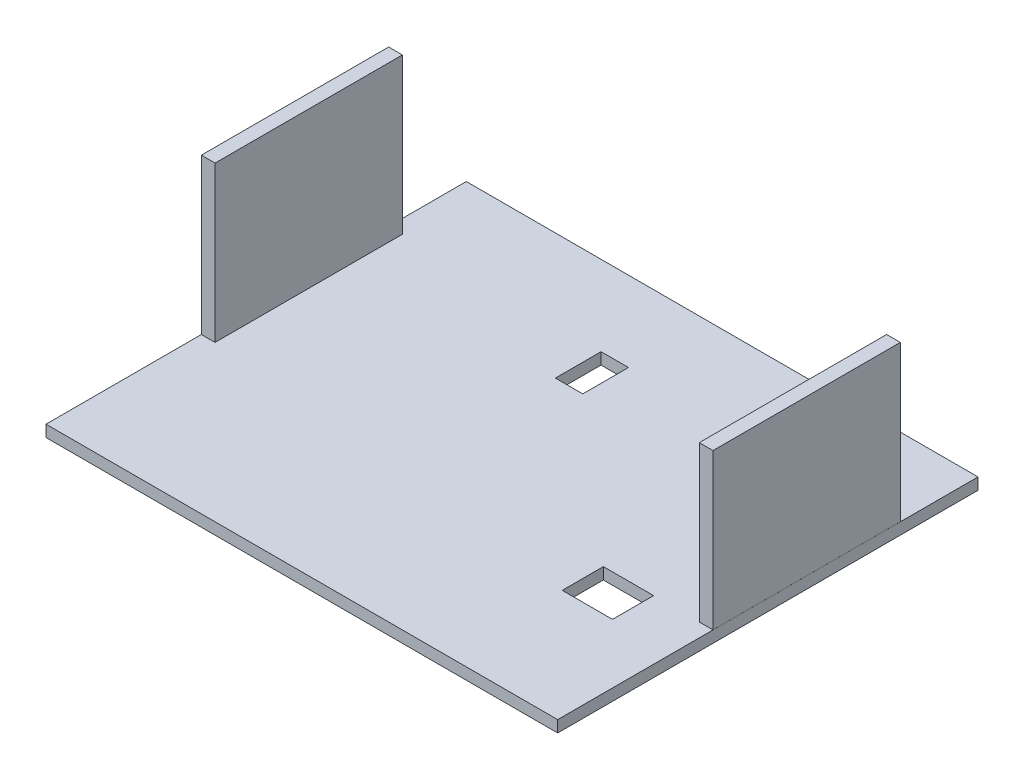
ISO-10303-21;
HEADER;
FILE_DESCRIPTION(('STEP AP214'),'2;1');
FILE_NAME('part.step','',(''),(''),'','','');
FILE_SCHEMA(('AUTOMOTIVE_DESIGN { 1 0 10303 214 1 1 1 1 }'));
ENDSEC;
DATA;
#1=APPLICATION_CONTEXT('core data for automotive mechanical design processes');
#2=APPLICATION_PROTOCOL_DEFINITION('international standard','automotive_design',2000,#1);
#3=PRODUCT_CONTEXT('',#1,'mechanical');
#4=PRODUCT('Part','Part','',(#3));
#5=PRODUCT_RELATED_PRODUCT_CATEGORY('part','',(#4));
#6=PRODUCT_DEFINITION_FORMATION('','',#4);
#7=PRODUCT_DEFINITION_CONTEXT('part definition',#1,'design');
#8=PRODUCT_DEFINITION('design','',#6,#7);
#9=PRODUCT_DEFINITION_SHAPE('','',#8);
#10=(LENGTH_UNIT() NAMED_UNIT(*) SI_UNIT(.MILLI.,.METRE.));
#11=(NAMED_UNIT(*) PLANE_ANGLE_UNIT() SI_UNIT($,.RADIAN.));
#12=(NAMED_UNIT(*) SI_UNIT($,.STERADIAN.) SOLID_ANGLE_UNIT());
#13=UNCERTAINTY_MEASURE_WITH_UNIT(LENGTH_MEASURE(1.E-05),#10,'distance_accuracy_value','');
#14=(GEOMETRIC_REPRESENTATION_CONTEXT(3) GLOBAL_UNCERTAINTY_ASSIGNED_CONTEXT((#13)) GLOBAL_UNIT_ASSIGNED_CONTEXT((#10,
#11,#12)) REPRESENTATION_CONTEXT('',''));
#15=CARTESIAN_POINT('',(0.,0.,0.));
#16=DIRECTION('',(0.,0.,1.));
#17=DIRECTION('',(1.,0.,0.));
#18=AXIS2_PLACEMENT_3D('',#15,#16,#17);
#19=CARTESIAN_POINT('',(27.998,18.27,-14.5));
#20=DIRECTION('',(-1.,0.,0.));
#21=DIRECTION('',(0.,0.,-1.));
#22=AXIS2_PLACEMENT_3D('',#19,#20,#21);
#23=PLANE('',#22);
#24=DIRECTION('',(0.,0.,1.));
#25=VECTOR('',#24,1.);
#26=CARTESIAN_POINT('',(27.998,1.27,-14.5));
#27=LINE('',#26,#25);
#28=CARTESIAN_POINT('',(27.998,1.27,-14.5));
#29=VERTEX_POINT('',#28);
#30=CARTESIAN_POINT('',(27.998,1.27,6.));
#31=VERTEX_POINT('',#30);
#32=EDGE_CURVE('E363',#29,#31,#27,.T.);
#33=ORIENTED_EDGE('',*,*,#32,.F.);
#34=DIRECTION('',(0.,-1.,0.));
#35=VECTOR('',#34,1.);
#36=CARTESIAN_POINT('',(27.998,18.27,-14.5));
#37=LINE('',#36,#35);
#38=CARTESIAN_POINT('',(27.998,18.27,-14.5));
#39=VERTEX_POINT('',#38);
#40=EDGE_CURVE('E326',#39,#29,#37,.T.);
#41=ORIENTED_EDGE('',*,*,#40,.F.);
#42=DIRECTION('',(0.,0.,1.));
#43=VECTOR('',#42,1.);
#44=CARTESIAN_POINT('',(27.998,18.27,-14.5));
#45=LINE('',#44,#43);
#46=CARTESIAN_POINT('',(27.998,18.27,6.));
#47=VERTEX_POINT('',#46);
#48=EDGE_CURVE('E360',#39,#47,#45,.T.);
#49=ORIENTED_EDGE('',*,*,#48,.T.);
#50=DIRECTION('',(0.,-1.,0.));
#51=VECTOR('',#50,1.);
#52=CARTESIAN_POINT('',(27.998,18.27,6.));
#53=LINE('',#52,#51);
#54=EDGE_CURVE('E350',#47,#31,#53,.T.);
#55=ORIENTED_EDGE('',*,*,#54,.T.);
#56=EDGE_LOOP('',(#33,#41,#49,#55));
#57=FACE_BOUND('',#56,.T.);
#58=ADVANCED_FACE('F39',(#57),#23,.F.);
#59=CARTESIAN_POINT('',(0.,18.27,0.));
#60=DIRECTION('',(0.,1.,0.));
#61=DIRECTION('',(0.,0.,1.));
#62=AXIS2_PLACEMENT_3D('',#59,#60,#61);
#63=PLANE('',#62);
#64=DIRECTION('',(0.,0.,-1.));
#65=VECTOR('',#64,1.);
#66=CARTESIAN_POINT('',(26.498,18.27,-14.5));
#67=LINE('',#66,#65);
#68=CARTESIAN_POINT('',(26.498,18.27,6.));
#69=VERTEX_POINT('',#68);
#70=CARTESIAN_POINT('',(26.498,18.27,-14.5));
#71=VERTEX_POINT('',#70);
#72=EDGE_CURVE('E357',#69,#71,#67,.T.);
#73=ORIENTED_EDGE('',*,*,#72,.F.);
#74=DIRECTION('',(-1.,0.,0.));
#75=VECTOR('',#74,1.);
#76=CARTESIAN_POINT('',(27.998,18.27,6.));
#77=LINE('',#76,#75);
#78=EDGE_CURVE('E346',#47,#69,#77,.T.);
#79=ORIENTED_EDGE('',*,*,#78,.F.);
#80=ORIENTED_EDGE('',*,*,#48,.F.);
#81=DIRECTION('',(1.,0.,0.));
#82=VECTOR('',#81,1.);
#83=CARTESIAN_POINT('',(27.998,18.27,-14.5));
#84=LINE('',#83,#82);
#85=EDGE_CURVE('E330',#71,#39,#84,.T.);
#86=ORIENTED_EDGE('',*,*,#85,.F.);
#87=EDGE_LOOP('',(#73,#79,#80,#86));
#88=FACE_BOUND('',#87,.T.);
#89=ADVANCED_FACE('F409',(#88),#63,.T.);
#90=CARTESIAN_POINT('',(26.498,18.27,-14.5));
#91=DIRECTION('',(1.,0.,0.));
#92=DIRECTION('',(0.,0.,1.));
#93=AXIS2_PLACEMENT_3D('',#90,#91,#92);
#94=PLANE('',#93);
#95=DIRECTION('',(0.,0.,-1.));
#96=VECTOR('',#95,1.);
#97=CARTESIAN_POINT('',(26.498,1.27,-14.5));
#98=LINE('',#97,#96);
#99=CARTESIAN_POINT('',(26.498,1.27,6.));
#100=VERTEX_POINT('',#99);
#101=CARTESIAN_POINT('',(26.498,1.27,-14.5));
#102=VERTEX_POINT('',#101);
#103=EDGE_CURVE('E354',#100,#102,#98,.T.);
#104=ORIENTED_EDGE('',*,*,#103,.F.);
#105=DIRECTION('',(0.,-1.,0.));
#106=VECTOR('',#105,1.);
#107=CARTESIAN_POINT('',(26.498,18.27,6.));
#108=LINE('',#107,#106);
#109=EDGE_CURVE('E342',#69,#100,#108,.T.);
#110=ORIENTED_EDGE('',*,*,#109,.F.);
#111=ORIENTED_EDGE('',*,*,#72,.T.);
#112=DIRECTION('',(0.,-1.,0.));
#113=VECTOR('',#112,1.);
#114=CARTESIAN_POINT('',(26.498,18.27,-14.5));
#115=LINE('',#114,#113);
#116=EDGE_CURVE('E334',#71,#102,#115,.T.);
#117=ORIENTED_EDGE('',*,*,#116,.T.);
#118=EDGE_LOOP('',(#104,#110,#111,#117));
#119=FACE_BOUND('',#118,.T.);
#120=ADVANCED_FACE('F414',(#119),#94,.F.);
#121=CARTESIAN_POINT('',(27.998,18.27,6.));
#122=DIRECTION('',(0.,0.,-1.));
#123=DIRECTION('',(1.,0.,0.));
#124=AXIS2_PLACEMENT_3D('',#121,#122,#123);
#125=PLANE('',#124);
#126=DIRECTION('',(-1.,0.,0.));
#127=VECTOR('',#126,1.);
#128=CARTESIAN_POINT('',(27.998,1.27,6.));
#129=LINE('',#128,#127);
#130=EDGE_CURVE('E338',#31,#100,#129,.T.);
#131=ORIENTED_EDGE('',*,*,#130,.F.);
#132=ORIENTED_EDGE('',*,*,#54,.F.);
#133=ORIENTED_EDGE('',*,*,#78,.T.);
#134=ORIENTED_EDGE('',*,*,#109,.T.);
#135=EDGE_LOOP('',(#131,#132,#133,#134));
#136=FACE_BOUND('',#135,.T.);
#137=ADVANCED_FACE('F430',(#136),#125,.F.);
#138=CARTESIAN_POINT('',(27.998,18.27,-14.5));
#139=DIRECTION('',(0.,0.,1.));
#140=DIRECTION('',(-1.,0.,0.));
#141=AXIS2_PLACEMENT_3D('',#138,#139,#140);
#142=PLANE('',#141);
#143=DIRECTION('',(1.,0.,0.));
#144=VECTOR('',#143,1.);
#145=CARTESIAN_POINT('',(27.998,1.27,-14.5));
#146=LINE('',#145,#144);
#147=EDGE_CURVE('E322',#102,#29,#146,.T.);
#148=ORIENTED_EDGE('',*,*,#147,.F.);
#149=ORIENTED_EDGE('',*,*,#116,.F.);
#150=ORIENTED_EDGE('',*,*,#85,.T.);
#151=ORIENTED_EDGE('',*,*,#40,.T.);
#152=EDGE_LOOP('',(#148,#149,#150,#151));
#153=FACE_BOUND('',#152,.T.);
#154=ADVANCED_FACE('F422',(#153),#142,.F.);
#155=CARTESIAN_POINT('',(0.,1.27,0.));
#156=DIRECTION('',(0.,1.,0.));
#157=DIRECTION('',(0.,0.,1.));
#158=AXIS2_PLACEMENT_3D('',#155,#156,#157);
#159=PLANE('',#158);
#160=DIRECTION('',(0.,0.,-1.));
#161=VECTOR('',#160,1.);
#162=CARTESIAN_POINT('',(21.498,1.27,10.5));
#163=LINE('',#162,#161);
#164=CARTESIAN_POINT('',(21.498,1.27,10.5));
#165=VERTEX_POINT('',#164);
#166=CARTESIAN_POINT('',(21.498,1.27,6.));
#167=VERTEX_POINT('',#166);
#168=EDGE_CURVE('E54',#165,#167,#163,.T.);
#169=ORIENTED_EDGE('',*,*,#168,.F.);
#170=DIRECTION('',(1.,0.,0.));
#171=VECTOR('',#170,1.);
#172=CARTESIAN_POINT('',(15.998,1.27,10.5));
#173=LINE('',#172,#171);
#174=CARTESIAN_POINT('',(15.998,1.27,10.5));
#175=VERTEX_POINT('',#174);
#176=EDGE_CURVE('E197',#175,#165,#173,.T.);
#177=ORIENTED_EDGE('',*,*,#176,.F.);
#178=DIRECTION('',(0.,0.,1.));
#179=VECTOR('',#178,1.);
#180=CARTESIAN_POINT('',(15.998,1.27,10.5));
#181=LINE('',#180,#179);
#182=CARTESIAN_POINT('',(15.998,1.27,6.));
#183=VERTEX_POINT('',#182);
#184=EDGE_CURVE('E179',#183,#175,#181,.T.);
#185=ORIENTED_EDGE('',*,*,#184,.F.);
#186=DIRECTION('',(-1.,0.,0.));
#187=VECTOR('',#186,1.);
#188=CARTESIAN_POINT('',(15.998,1.27,6.));
#189=LINE('',#188,#187);
#190=EDGE_CURVE('E189',#167,#183,#189,.T.);
#191=ORIENTED_EDGE('',*,*,#190,.F.);
#192=EDGE_LOOP('',(#169,#177,#185,#191));
#193=FACE_BOUND('',#192,.T.);
#194=DIRECTION('',(0.,0.,-1.));
#195=VECTOR('',#194,1.);
#196=CARTESIAN_POINT('',(-1.49800000000001,1.27,-14.2430071371835));
#197=LINE('',#196,#195);
#198=CARTESIAN_POINT('',(-1.498,1.27,-9.24300713718349));
#199=VERTEX_POINT('',#198);
#200=CARTESIAN_POINT('',(-1.49800000000001,1.27,-14.2430071371835));
#201=VERTEX_POINT('',#200);
#202=EDGE_CURVE('E207',#199,#201,#197,.T.);
#203=ORIENTED_EDGE('',*,*,#202,.F.);
#204=DIRECTION('',(1.,0.,0.));
#205=VECTOR('',#204,1.);
#206=CARTESIAN_POINT('',(-4.498,1.27,-9.24300713718349));
#207=LINE('',#206,#205);
#208=CARTESIAN_POINT('',(-4.498,1.27,-9.24300713718349));
#209=VERTEX_POINT('',#208);
#210=EDGE_CURVE('E222',#209,#199,#207,.T.);
#211=ORIENTED_EDGE('',*,*,#210,.F.);
#212=DIRECTION('',(0.,0.,1.));
#213=VECTOR('',#212,1.);
#214=CARTESIAN_POINT('',(-4.49800000000001,1.27,-14.2430071371835));
#215=LINE('',#214,#213);
#216=CARTESIAN_POINT('',(-4.49800000000001,1.27,-14.2430071371835));
#217=VERTEX_POINT('',#216);
#218=EDGE_CURVE('E218',#217,#209,#215,.T.);
#219=ORIENTED_EDGE('',*,*,#218,.F.);
#220=DIRECTION('',(-1.,0.,0.));
#221=VECTOR('',#220,1.);
#222=CARTESIAN_POINT('',(-4.49800000000001,1.27,-14.2430071371835));
#223=LINE('',#222,#221);
#224=EDGE_CURVE('E214',#201,#217,#223,.T.);
#225=ORIENTED_EDGE('',*,*,#224,.F.);
#226=EDGE_LOOP('',(#203,#211,#219,#225));
#227=FACE_BOUND('',#226,.T.);
#228=ORIENTED_EDGE('',*,*,#147,.T.);
#229=ORIENTED_EDGE('',*,*,#32,.T.);
#230=ORIENTED_EDGE('',*,*,#130,.T.);
#231=ORIENTED_EDGE('',*,*,#103,.T.);
#232=EDGE_LOOP('',(#228,#229,#230,#231));
#233=FACE_BOUND('',#232,.T.);
#234=DIRECTION('',(0.,0.,-1.));
#235=VECTOR('',#234,1.);
#236=CARTESIAN_POINT('',(28.,1.27,-23.));
#237=LINE('',#236,#235);
#238=CARTESIAN_POINT('',(28.,1.27,23.));
#239=VERTEX_POINT('',#238);
#240=CARTESIAN_POINT('',(28.,1.27,-23.));
#241=VERTEX_POINT('',#240);
#242=EDGE_CURVE('E281',#239,#241,#237,.T.);
#243=ORIENTED_EDGE('',*,*,#242,.T.);
#244=DIRECTION('',(-1.,0.,0.));
#245=VECTOR('',#244,1.);
#246=CARTESIAN_POINT('',(-28.,1.27,-23.));
#247=LINE('',#246,#245);
#248=CARTESIAN_POINT('',(-28.,1.27,-23.));
#249=VERTEX_POINT('',#248);
#250=EDGE_CURVE('E285',#241,#249,#247,.T.);
#251=ORIENTED_EDGE('',*,*,#250,.T.);
#252=DIRECTION('',(0.,0.,1.));
#253=VECTOR('',#252,1.);
#254=CARTESIAN_POINT('',(-28.,1.27,-23.));
#255=LINE('',#254,#253);
#256=CARTESIAN_POINT('',(-28.,1.27,23.));
#257=VERTEX_POINT('',#256);
#258=EDGE_CURVE('E289',#249,#257,#255,.T.);
#259=ORIENTED_EDGE('',*,*,#258,.T.);
#260=DIRECTION('',(1.,0.,0.));
#261=VECTOR('',#260,1.);
#262=CARTESIAN_POINT('',(-28.,1.27,23.));
#263=LINE('',#262,#261);
#264=EDGE_CURVE('E292',#257,#239,#263,.T.);
#265=ORIENTED_EDGE('',*,*,#264,.T.);
#266=EDGE_LOOP('',(#243,#251,#259,#265));
#267=FACE_BOUND('',#266,.T.);
#268=DIRECTION('',(-1.,0.,0.));
#269=VECTOR('',#268,1.);
#270=CARTESIAN_POINT('',(-27.998,1.27,-14.5));
#271=LINE('',#270,#269);
#272=CARTESIAN_POINT('',(-26.498,1.27,-14.5));
#273=VERTEX_POINT('',#272);
#274=CARTESIAN_POINT('',(-27.998,1.27,-14.5));
#275=VERTEX_POINT('',#274);
#276=EDGE_CURVE('E258',#273,#275,#271,.T.);
#277=ORIENTED_EDGE('',*,*,#276,.F.);
#278=DIRECTION('',(0.,0.,-1.));
#279=VECTOR('',#278,1.);
#280=CARTESIAN_POINT('',(-26.498,1.27,-14.5));
#281=LINE('',#280,#279);
#282=CARTESIAN_POINT('',(-26.498,1.27,6.));
#283=VERTEX_POINT('',#282);
#284=EDGE_CURVE('E230',#283,#273,#281,.T.);
#285=ORIENTED_EDGE('',*,*,#284,.F.);
#286=DIRECTION('',(1.,0.,0.));
#287=VECTOR('',#286,1.);
#288=CARTESIAN_POINT('',(-27.998,1.27,6.));
#289=LINE('',#288,#287);
#290=CARTESIAN_POINT('',(-27.998,1.27,6.));
#291=VERTEX_POINT('',#290);
#292=EDGE_CURVE('E245',#291,#283,#289,.T.);
#293=ORIENTED_EDGE('',*,*,#292,.F.);
#294=DIRECTION('',(0.,0.,1.));
#295=VECTOR('',#294,1.);
#296=CARTESIAN_POINT('',(-27.998,1.27,-14.5));
#297=LINE('',#296,#295);
#298=EDGE_CURVE('E261',#275,#291,#297,.T.);
#299=ORIENTED_EDGE('',*,*,#298,.F.);
#300=EDGE_LOOP('',(#277,#285,#293,#299));
#301=FACE_BOUND('',#300,.T.);
#302=ADVANCED_FACE('F194',(#193,#227,#233,#267,#301),#159,.T.);
#303=CARTESIAN_POINT('',(28.,1.27,-23.));
#304=DIRECTION('',(-1.,0.,0.));
#305=DIRECTION('',(0.,0.,1.));
#306=AXIS2_PLACEMENT_3D('',#303,#304,#305);
#307=PLANE('',#306);
#308=DIRECTION('',(0.,0.,-1.));
#309=VECTOR('',#308,1.);
#310=CARTESIAN_POINT('',(28.,0.,-23.));
#311=LINE('',#310,#309);
#312=CARTESIAN_POINT('',(28.,0.,23.));
#313=VERTEX_POINT('',#312);
#314=CARTESIAN_POINT('',(28.,0.,-23.));
#315=VERTEX_POINT('',#314);
#316=EDGE_CURVE('E280',#313,#315,#311,.T.);
#317=ORIENTED_EDGE('',*,*,#316,.T.);
#318=DIRECTION('',(0.,-1.,0.));
#319=VECTOR('',#318,1.);
#320=CARTESIAN_POINT('',(28.,1.27,-23.));
#321=LINE('',#320,#319);
#322=EDGE_CURVE('E318',#241,#315,#321,.T.);
#323=ORIENTED_EDGE('',*,*,#322,.F.);
#324=ORIENTED_EDGE('',*,*,#242,.F.);
#325=DIRECTION('',(0.,-1.,0.));
#326=VECTOR('',#325,1.);
#327=CARTESIAN_POINT('',(28.,1.27,23.));
#328=LINE('',#327,#326);
#329=EDGE_CURVE('E295',#239,#313,#328,.T.);
#330=ORIENTED_EDGE('',*,*,#329,.T.);
#331=EDGE_LOOP('',(#317,#323,#324,#330));
#332=FACE_BOUND('',#331,.T.);
#333=ADVANCED_FACE('F440',(#332),#307,.F.);
#334=CARTESIAN_POINT('',(-28.,1.27,-23.));
#335=DIRECTION('',(0.,0.,1.));
#336=DIRECTION('',(1.,0.,0.));
#337=AXIS2_PLACEMENT_3D('',#334,#335,#336);
#338=PLANE('',#337);
#339=DIRECTION('',(-1.,0.,0.));
#340=VECTOR('',#339,1.);
#341=CARTESIAN_POINT('',(-28.,0.,-23.));
#342=LINE('',#341,#340);
#343=CARTESIAN_POINT('',(-28.,0.,-23.));
#344=VERTEX_POINT('',#343);
#345=EDGE_CURVE('E299',#315,#344,#342,.T.);
#346=ORIENTED_EDGE('',*,*,#345,.T.);
#347=DIRECTION('',(0.,-1.,0.));
#348=VECTOR('',#347,1.);
#349=CARTESIAN_POINT('',(-28.,1.27,-23.));
#350=LINE('',#349,#348);
#351=EDGE_CURVE('E314',#249,#344,#350,.T.);
#352=ORIENTED_EDGE('',*,*,#351,.F.);
#353=ORIENTED_EDGE('',*,*,#250,.F.);
#354=ORIENTED_EDGE('',*,*,#322,.T.);
#355=EDGE_LOOP('',(#346,#352,#353,#354));
#356=FACE_BOUND('',#355,.T.);
#357=ADVANCED_FACE('F443',(#356),#338,.F.);
#358=CARTESIAN_POINT('',(-28.,1.27,-23.));
#359=DIRECTION('',(1.,0.,0.));
#360=DIRECTION('',(0.,0.,-1.));
#361=AXIS2_PLACEMENT_3D('',#358,#359,#360);
#362=PLANE('',#361);
#363=DIRECTION('',(0.,0.,1.));
#364=VECTOR('',#363,1.);
#365=CARTESIAN_POINT('',(-28.,0.,-23.));
#366=LINE('',#365,#364);
#367=CARTESIAN_POINT('',(-28.,0.,23.));
#368=VERTEX_POINT('',#367);
#369=EDGE_CURVE('E302',#344,#368,#366,.T.);
#370=ORIENTED_EDGE('',*,*,#369,.T.);
#371=DIRECTION('',(0.,-1.,0.));
#372=VECTOR('',#371,1.);
#373=CARTESIAN_POINT('',(-28.,1.27,23.));
#374=LINE('',#373,#372);
#375=EDGE_CURVE('E310',#257,#368,#374,.T.);
#376=ORIENTED_EDGE('',*,*,#375,.F.);
#377=ORIENTED_EDGE('',*,*,#258,.F.);
#378=ORIENTED_EDGE('',*,*,#351,.T.);
#379=EDGE_LOOP('',(#370,#376,#377,#378));
#380=FACE_BOUND('',#379,.T.);
#381=ADVANCED_FACE('F447',(#380),#362,.F.);
#382=CARTESIAN_POINT('',(-28.,1.27,23.));
#383=DIRECTION('',(0.,0.,-1.));
#384=DIRECTION('',(-1.,0.,0.));
#385=AXIS2_PLACEMENT_3D('',#382,#383,#384);
#386=PLANE('',#385);
#387=DIRECTION('',(1.,0.,0.));
#388=VECTOR('',#387,1.);
#389=CARTESIAN_POINT('',(-28.,0.,23.));
#390=LINE('',#389,#388);
#391=EDGE_CURVE('E286',#368,#313,#390,.T.);
#392=ORIENTED_EDGE('',*,*,#391,.T.);
#393=ORIENTED_EDGE('',*,*,#329,.F.);
#394=ORIENTED_EDGE('',*,*,#264,.F.);
#395=ORIENTED_EDGE('',*,*,#375,.T.);
#396=EDGE_LOOP('',(#392,#393,#394,#395));
#397=FACE_BOUND('',#396,.T.);
#398=ADVANCED_FACE('F451',(#397),#386,.F.);
#399=CARTESIAN_POINT('',(0.,0.,0.));
#400=DIRECTION('',(0.,1.,0.));
#401=DIRECTION('',(0.,0.,1.));
#402=AXIS2_PLACEMENT_3D('',#399,#400,#401);
#403=PLANE('',#402);
#404=DIRECTION('',(1.,0.,0.));
#405=VECTOR('',#404,1.);
#406=CARTESIAN_POINT('',(0.,0.,10.5));
#407=LINE('',#406,#405);
#408=CARTESIAN_POINT('',(15.998,0.,10.5));
#409=VERTEX_POINT('',#408);
#410=CARTESIAN_POINT('',(21.498,0.,10.5));
#411=VERTEX_POINT('',#410);
#412=EDGE_CURVE('E47',#409,#411,#407,.T.);
#413=ORIENTED_EDGE('',*,*,#412,.T.);
#414=DIRECTION('',(0.,0.,-1.));
#415=VECTOR('',#414,1.);
#416=CARTESIAN_POINT('',(21.498,0.,0.));
#417=LINE('',#416,#415);
#418=CARTESIAN_POINT('',(21.498,0.,6.));
#419=VERTEX_POINT('',#418);
#420=EDGE_CURVE('E11',#411,#419,#417,.T.);
#421=ORIENTED_EDGE('',*,*,#420,.T.);
#422=DIRECTION('',(-1.,0.,0.));
#423=VECTOR('',#422,1.);
#424=CARTESIAN_POINT('',(0.,0.,6.));
#425=LINE('',#424,#423);
#426=CARTESIAN_POINT('',(15.998,0.,6.));
#427=VERTEX_POINT('',#426);
#428=EDGE_CURVE('E382',#419,#427,#425,.T.);
#429=ORIENTED_EDGE('',*,*,#428,.T.);
#430=DIRECTION('',(0.,0.,1.));
#431=VECTOR('',#430,1.);
#432=CARTESIAN_POINT('',(15.998,0.,0.));
#433=LINE('',#432,#431);
#434=EDGE_CURVE('E182',#427,#409,#433,.T.);
#435=ORIENTED_EDGE('',*,*,#434,.T.);
#436=EDGE_LOOP('',(#413,#421,#429,#435));
#437=FACE_BOUND('',#436,.T.);
#438=DIRECTION('',(1.,0.,0.));
#439=VECTOR('',#438,1.);
#440=CARTESIAN_POINT('',(0.,0.,-9.24300713718349));
#441=LINE('',#440,#439);
#442=CARTESIAN_POINT('',(-4.498,0.,-9.24300713718349));
#443=VERTEX_POINT('',#442);
#444=CARTESIAN_POINT('',(-1.498,0.,-9.24300713718349));
#445=VERTEX_POINT('',#444);
#446=EDGE_CURVE('E374',#443,#445,#441,.T.);
#447=ORIENTED_EDGE('',*,*,#446,.T.);
#448=DIRECTION('',(0.,0.,-1.));
#449=VECTOR('',#448,1.);
#450=CARTESIAN_POINT('',(-1.498,0.,0.));
#451=LINE('',#450,#449);
#452=CARTESIAN_POINT('',(-1.49800000000001,0.,-14.2430071371835));
#453=VERTEX_POINT('',#452);
#454=EDGE_CURVE('E378',#445,#453,#451,.T.);
#455=ORIENTED_EDGE('',*,*,#454,.T.);
#456=DIRECTION('',(-1.,0.,0.));
#457=VECTOR('',#456,1.);
#458=CARTESIAN_POINT('',(0.,0.,-14.2430071371835));
#459=LINE('',#458,#457);
#460=CARTESIAN_POINT('',(-4.49800000000001,0.,-14.2430071371835));
#461=VERTEX_POINT('',#460);
#462=EDGE_CURVE('E366',#453,#461,#459,.T.);
#463=ORIENTED_EDGE('',*,*,#462,.T.);
#464=DIRECTION('',(0.,0.,1.));
#465=VECTOR('',#464,1.);
#466=CARTESIAN_POINT('',(-4.498,0.,0.));
#467=LINE('',#466,#465);
#468=EDGE_CURVE('E370',#461,#443,#467,.T.);
#469=ORIENTED_EDGE('',*,*,#468,.T.);
#470=EDGE_LOOP('',(#447,#455,#463,#469));
#471=FACE_BOUND('',#470,.T.);
#472=ORIENTED_EDGE('',*,*,#316,.F.);
#473=ORIENTED_EDGE('',*,*,#391,.F.);
#474=ORIENTED_EDGE('',*,*,#369,.F.);
#475=ORIENTED_EDGE('',*,*,#345,.F.);
#476=EDGE_LOOP('',(#472,#473,#474,#475));
#477=FACE_BOUND('',#476,.T.);
#478=ADVANCED_FACE('F389',(#437,#471,#477),#403,.F.);
#479=CARTESIAN_POINT('',(-26.498,18.27,-14.5));
#480=DIRECTION('',(-1.,0.,0.));
#481=DIRECTION('',(0.,0.,1.));
#482=AXIS2_PLACEMENT_3D('',#479,#480,#481);
#483=PLANE('',#482);
#484=ORIENTED_EDGE('',*,*,#284,.T.);
#485=DIRECTION('',(0.,-1.,0.));
#486=VECTOR('',#485,1.);
#487=CARTESIAN_POINT('',(-26.498,18.27,-14.5));
#488=LINE('',#487,#486);
#489=CARTESIAN_POINT('',(-26.498,18.27,-14.5));
#490=VERTEX_POINT('',#489);
#491=EDGE_CURVE('E277',#490,#273,#488,.T.);
#492=ORIENTED_EDGE('',*,*,#491,.F.);
#493=DIRECTION('',(0.,0.,-1.));
#494=VECTOR('',#493,1.);
#495=CARTESIAN_POINT('',(-26.498,18.27,-14.5));
#496=LINE('',#495,#494);
#497=CARTESIAN_POINT('',(-26.498,18.27,6.));
#498=VERTEX_POINT('',#497);
#499=EDGE_CURVE('E240',#498,#490,#496,.T.);
#500=ORIENTED_EDGE('',*,*,#499,.F.);
#501=DIRECTION('',(0.,-1.,0.));
#502=VECTOR('',#501,1.);
#503=CARTESIAN_POINT('',(-26.498,18.27,6.));
#504=LINE('',#503,#502);
#505=EDGE_CURVE('E254',#498,#283,#504,.T.);
#506=ORIENTED_EDGE('',*,*,#505,.T.);
#507=EDGE_LOOP('',(#484,#492,#500,#506));
#508=FACE_BOUND('',#507,.T.);
#509=ADVANCED_FACE('F458',(#508),#483,.F.);
#510=CARTESIAN_POINT('',(-27.998,18.27,-14.5));
#511=DIRECTION('',(0.,0.,1.));
#512=DIRECTION('',(1.,0.,0.));
#513=AXIS2_PLACEMENT_3D('',#510,#511,#512);
#514=PLANE('',#513);
#515=ORIENTED_EDGE('',*,*,#276,.T.);
#516=DIRECTION('',(0.,-1.,0.));
#517=VECTOR('',#516,1.);
#518=CARTESIAN_POINT('',(-27.998,18.27,-14.5));
#519=LINE('',#518,#517);
#520=CARTESIAN_POINT('',(-27.998,18.27,-14.5));
#521=VERTEX_POINT('',#520);
#522=EDGE_CURVE('E273',#521,#275,#519,.T.);
#523=ORIENTED_EDGE('',*,*,#522,.F.);
#524=DIRECTION('',(-1.,0.,0.));
#525=VECTOR('',#524,1.);
#526=CARTESIAN_POINT('',(-27.998,18.27,-14.5));
#527=LINE('',#526,#525);
#528=EDGE_CURVE('E244',#490,#521,#527,.T.);
#529=ORIENTED_EDGE('',*,*,#528,.F.);
#530=ORIENTED_EDGE('',*,*,#491,.T.);
#531=EDGE_LOOP('',(#515,#523,#529,#530));
#532=FACE_BOUND('',#531,.T.);
#533=ADVANCED_FACE('F463',(#532),#514,.F.);
#534=CARTESIAN_POINT('',(-27.998,18.27,-14.5));
#535=DIRECTION('',(1.,0.,0.));
#536=DIRECTION('',(0.,0.,-1.));
#537=AXIS2_PLACEMENT_3D('',#534,#535,#536);
#538=PLANE('',#537);
#539=ORIENTED_EDGE('',*,*,#298,.T.);
#540=DIRECTION('',(0.,-1.,0.));
#541=VECTOR('',#540,1.);
#542=CARTESIAN_POINT('',(-27.998,18.27,6.));
#543=LINE('',#542,#541);
#544=CARTESIAN_POINT('',(-27.998,18.27,6.));
#545=VERTEX_POINT('',#544);
#546=EDGE_CURVE('E270',#545,#291,#543,.T.);
#547=ORIENTED_EDGE('',*,*,#546,.F.);
#548=DIRECTION('',(0.,0.,1.));
#549=VECTOR('',#548,1.);
#550=CARTESIAN_POINT('',(-27.998,18.27,-14.5));
#551=LINE('',#550,#549);
#552=EDGE_CURVE('E248',#521,#545,#551,.T.);
#553=ORIENTED_EDGE('',*,*,#552,.F.);
#554=ORIENTED_EDGE('',*,*,#522,.T.);
#555=EDGE_LOOP('',(#539,#547,#553,#554));
#556=FACE_BOUND('',#555,.T.);
#557=ADVANCED_FACE('F467',(#556),#538,.F.);
#558=CARTESIAN_POINT('',(-27.998,18.27,6.));
#559=DIRECTION('',(0.,0.,-1.));
#560=DIRECTION('',(-1.,0.,0.));
#561=AXIS2_PLACEMENT_3D('',#558,#559,#560);
#562=PLANE('',#561);
#563=ORIENTED_EDGE('',*,*,#292,.T.);
#564=ORIENTED_EDGE('',*,*,#505,.F.);
#565=DIRECTION('',(1.,0.,0.));
#566=VECTOR('',#565,1.);
#567=CARTESIAN_POINT('',(-27.998,18.27,6.));
#568=LINE('',#567,#566);
#569=EDGE_CURVE('E251',#545,#498,#568,.T.);
#570=ORIENTED_EDGE('',*,*,#569,.F.);
#571=ORIENTED_EDGE('',*,*,#546,.T.);
#572=EDGE_LOOP('',(#563,#564,#570,#571));
#573=FACE_BOUND('',#572,.T.);
#574=ADVANCED_FACE('F471',(#573),#562,.F.);
#575=CARTESIAN_POINT('',(0.,18.27,0.));
#576=DIRECTION('',(0.,1.,0.));
#577=DIRECTION('',(0.,0.,1.));
#578=AXIS2_PLACEMENT_3D('',#575,#576,#577);
#579=PLANE('',#578);
#580=ORIENTED_EDGE('',*,*,#499,.T.);
#581=ORIENTED_EDGE('',*,*,#528,.T.);
#582=ORIENTED_EDGE('',*,*,#552,.T.);
#583=ORIENTED_EDGE('',*,*,#569,.T.);
#584=EDGE_LOOP('',(#580,#581,#582,#583));
#585=FACE_BOUND('',#584,.T.);
#586=ADVANCED_FACE('F475',(#585),#579,.T.);
#587=CARTESIAN_POINT('',(-1.49800000000001,-15.73,-14.2430071371835));
#588=DIRECTION('',(1.,0.,0.));
#589=DIRECTION('',(0.,0.,-1.));
#590=AXIS2_PLACEMENT_3D('',#587,#588,#589);
#591=PLANE('',#590);
#592=DIRECTION('',(0.,1.,0.));
#593=VECTOR('',#592,1.);
#594=CARTESIAN_POINT('',(-1.498,-15.73,-9.24300713718349));
#595=LINE('',#594,#593);
#596=EDGE_CURVE('E227',#445,#199,#595,.T.);
#597=ORIENTED_EDGE('',*,*,#596,.T.);
#598=ORIENTED_EDGE('',*,*,#202,.T.);
#599=DIRECTION('',(0.,1.,0.));
#600=VECTOR('',#599,1.);
#601=CARTESIAN_POINT('',(-1.49800000000001,-15.73,-14.2430071371835));
#602=LINE('',#601,#600);
#603=EDGE_CURVE('E226',#453,#201,#602,.T.);
#604=ORIENTED_EDGE('',*,*,#603,.F.);
#605=ORIENTED_EDGE('',*,*,#454,.F.);
#606=EDGE_LOOP('',(#597,#598,#604,#605));
#607=FACE_BOUND('',#606,.T.);
#608=ADVANCED_FACE('F479',(#607),#591,.F.);
#609=CARTESIAN_POINT('',(-4.498,-15.73,-9.24300713718349));
#610=DIRECTION('',(0.,0.,1.));
#611=DIRECTION('',(1.,0.,0.));
#612=AXIS2_PLACEMENT_3D('',#609,#610,#611);
#613=PLANE('',#612);
#614=DIRECTION('',(0.,1.,0.));
#615=VECTOR('',#614,1.);
#616=CARTESIAN_POINT('',(-4.498,-15.73,-9.24300713718349));
#617=LINE('',#616,#615);
#618=EDGE_CURVE('E231',#443,#209,#617,.T.);
#619=ORIENTED_EDGE('',*,*,#618,.T.);
#620=ORIENTED_EDGE('',*,*,#210,.T.);
#621=ORIENTED_EDGE('',*,*,#596,.F.);
#622=ORIENTED_EDGE('',*,*,#446,.F.);
#623=EDGE_LOOP('',(#619,#620,#621,#622));
#624=FACE_BOUND('',#623,.T.);
#625=ADVANCED_FACE('F482',(#624),#613,.F.);
#626=CARTESIAN_POINT('',(-4.49800000000001,-15.73,-14.2430071371835));
#627=DIRECTION('',(-1.,0.,0.));
#628=DIRECTION('',(0.,0.,1.));
#629=AXIS2_PLACEMENT_3D('',#626,#627,#628);
#630=PLANE('',#629);
#631=DIRECTION('',(0.,1.,0.));
#632=VECTOR('',#631,1.);
#633=CARTESIAN_POINT('',(-4.49800000000001,-15.73,-14.2430071371835));
#634=LINE('',#633,#632);
#635=EDGE_CURVE('E234',#461,#217,#634,.T.);
#636=ORIENTED_EDGE('',*,*,#635,.T.);
#637=ORIENTED_EDGE('',*,*,#218,.T.);
#638=ORIENTED_EDGE('',*,*,#618,.F.);
#639=ORIENTED_EDGE('',*,*,#468,.F.);
#640=EDGE_LOOP('',(#636,#637,#638,#639));
#641=FACE_BOUND('',#640,.T.);
#642=ADVANCED_FACE('F403',(#641),#630,.F.);
#643=CARTESIAN_POINT('',(-4.49800000000001,-15.73,-14.2430071371835));
#644=DIRECTION('',(0.,0.,-1.));
#645=DIRECTION('',(-1.,0.,0.));
#646=AXIS2_PLACEMENT_3D('',#643,#644,#645);
#647=PLANE('',#646);
#648=ORIENTED_EDGE('',*,*,#603,.T.);
#649=ORIENTED_EDGE('',*,*,#224,.T.);
#650=ORIENTED_EDGE('',*,*,#635,.F.);
#651=ORIENTED_EDGE('',*,*,#462,.F.);
#652=EDGE_LOOP('',(#648,#649,#650,#651));
#653=FACE_BOUND('',#652,.T.);
#654=ADVANCED_FACE('F396',(#653),#647,.F.);
#655=CARTESIAN_POINT('',(21.498,-15.73,10.5));
#656=DIRECTION('',(1.,0.,0.));
#657=DIRECTION('',(0.,0.,-1.));
#658=AXIS2_PLACEMENT_3D('',#655,#656,#657);
#659=PLANE('',#658);
#660=DIRECTION('',(0.,1.,0.));
#661=VECTOR('',#660,1.);
#662=CARTESIAN_POINT('',(21.498,-15.73,10.5));
#663=LINE('',#662,#661);
#664=EDGE_CURVE('E204',#411,#165,#663,.T.);
#665=ORIENTED_EDGE('',*,*,#664,.T.);
#666=ORIENTED_EDGE('',*,*,#168,.T.);
#667=DIRECTION('',(0.,1.,0.));
#668=VECTOR('',#667,1.);
#669=CARTESIAN_POINT('',(21.498,-15.73,6.));
#670=LINE('',#669,#668);
#671=EDGE_CURVE('E186',#419,#167,#670,.T.);
#672=ORIENTED_EDGE('',*,*,#671,.F.);
#673=ORIENTED_EDGE('',*,*,#420,.F.);
#674=EDGE_LOOP('',(#665,#666,#672,#673));
#675=FACE_BOUND('',#674,.T.);
#676=ADVANCED_FACE('F394',(#675),#659,.F.);
#677=CARTESIAN_POINT('',(15.998,-15.73,10.5));
#678=DIRECTION('',(0.,0.,1.));
#679=DIRECTION('',(1.,0.,0.));
#680=AXIS2_PLACEMENT_3D('',#677,#678,#679);
#681=PLANE('',#680);
#682=DIRECTION('',(0.,1.,0.));
#683=VECTOR('',#682,1.);
#684=CARTESIAN_POINT('',(15.998,-15.73,10.5));
#685=LINE('',#684,#683);
#686=EDGE_CURVE('E185',#409,#175,#685,.T.);
#687=ORIENTED_EDGE('',*,*,#686,.T.);
#688=ORIENTED_EDGE('',*,*,#176,.T.);
#689=ORIENTED_EDGE('',*,*,#664,.F.);
#690=ORIENTED_EDGE('',*,*,#412,.F.);
#691=EDGE_LOOP('',(#687,#688,#689,#690));
#692=FACE_BOUND('',#691,.T.);
#693=ADVANCED_FACE('F393',(#692),#681,.F.);
#694=CARTESIAN_POINT('',(15.998,-15.73,10.5));
#695=DIRECTION('',(-1.,0.,0.));
#696=DIRECTION('',(0.,0.,1.));
#697=AXIS2_PLACEMENT_3D('',#694,#695,#696);
#698=PLANE('',#697);
#699=DIRECTION('',(0.,1.,0.));
#700=VECTOR('',#699,1.);
#701=CARTESIAN_POINT('',(15.998,-15.73,6.));
#702=LINE('',#701,#700);
#703=EDGE_CURVE('E62',#427,#183,#702,.T.);
#704=ORIENTED_EDGE('',*,*,#703,.T.);
#705=ORIENTED_EDGE('',*,*,#184,.T.);
#706=ORIENTED_EDGE('',*,*,#686,.F.);
#707=ORIENTED_EDGE('',*,*,#434,.F.);
#708=EDGE_LOOP('',(#704,#705,#706,#707));
#709=FACE_BOUND('',#708,.T.);
#710=ADVANCED_FACE('F176',(#709),#698,.F.);
#711=CARTESIAN_POINT('',(15.998,-15.73,6.));
#712=DIRECTION('',(0.,0.,-1.));
#713=DIRECTION('',(-1.,0.,0.));
#714=AXIS2_PLACEMENT_3D('',#711,#712,#713);
#715=PLANE('',#714);
#716=ORIENTED_EDGE('',*,*,#671,.T.);
#717=ORIENTED_EDGE('',*,*,#190,.T.);
#718=ORIENTED_EDGE('',*,*,#703,.F.);
#719=ORIENTED_EDGE('',*,*,#428,.F.);
#720=EDGE_LOOP('',(#716,#717,#718,#719));
#721=FACE_BOUND('',#720,.T.);
#722=ADVANCED_FACE('F190',(#721),#715,.F.);
#723=CLOSED_SHELL('',(#58,#89,#120,#137,#154,#302,#333,#357,#381,#398,#478,#509,#533,#557,#574,
#586,#608,#625,#642,#654,#676,#693,#710,#722));
#724=MANIFOLD_SOLID_BREP('B2',#723);
#725=ADVANCED_BREP_SHAPE_REPRESENTATION('',(#18,#724),#14);
#726=SHAPE_DEFINITION_REPRESENTATION(#9,#725);
ENDSEC;
END-ISO-10303-21;
